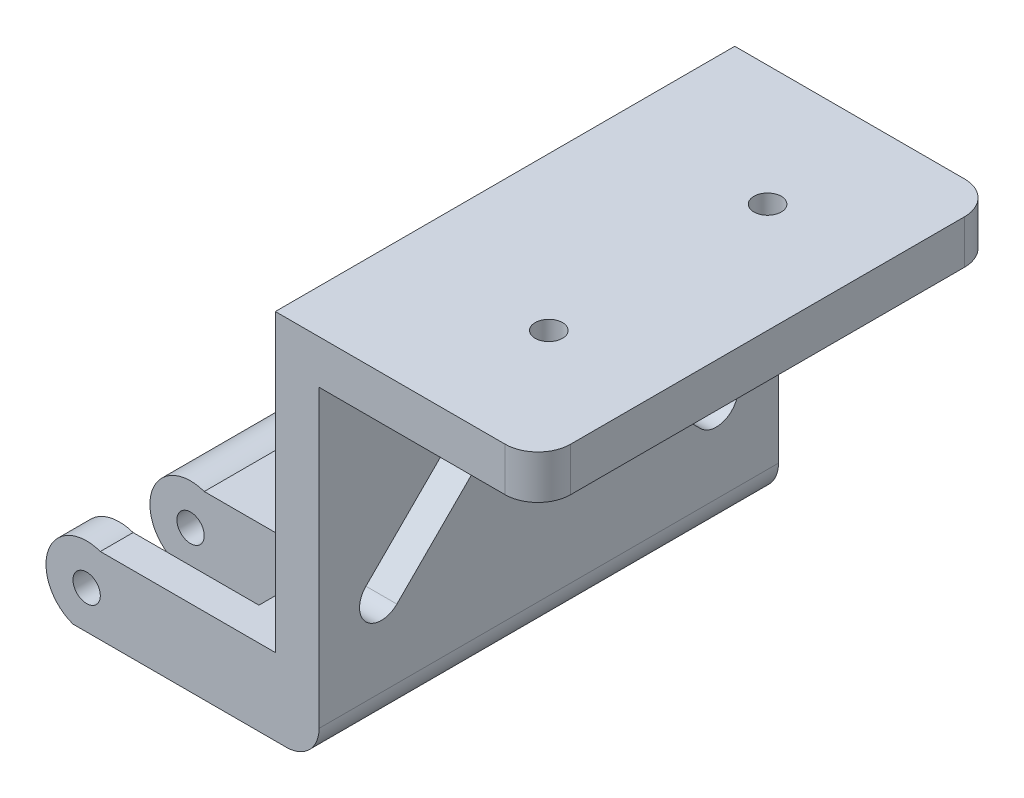
ISO-10303-21;
HEADER;
FILE_DESCRIPTION(('STEP AP214'),'2;1');
FILE_NAME('part.step','',(''),(''),'','','');
FILE_SCHEMA(('AUTOMOTIVE_DESIGN { 1 0 10303 214 1 1 1 1 }'));
ENDSEC;
DATA;
#1=APPLICATION_CONTEXT('core data for automotive mechanical design processes');
#2=APPLICATION_PROTOCOL_DEFINITION('international standard','automotive_design',2000,#1);
#3=PRODUCT_CONTEXT('',#1,'mechanical');
#4=PRODUCT('Part','Part','',(#3));
#5=PRODUCT_RELATED_PRODUCT_CATEGORY('part','',(#4));
#6=PRODUCT_DEFINITION_FORMATION('','',#4);
#7=PRODUCT_DEFINITION_CONTEXT('part definition',#1,'design');
#8=PRODUCT_DEFINITION('design','',#6,#7);
#9=PRODUCT_DEFINITION_SHAPE('','',#8);
#10=(LENGTH_UNIT() NAMED_UNIT(*) SI_UNIT(.MILLI.,.METRE.));
#11=(NAMED_UNIT(*) PLANE_ANGLE_UNIT() SI_UNIT($,.RADIAN.));
#12=(NAMED_UNIT(*) SI_UNIT($,.STERADIAN.) SOLID_ANGLE_UNIT());
#13=UNCERTAINTY_MEASURE_WITH_UNIT(LENGTH_MEASURE(1.E-05),#10,'distance_accuracy_value','');
#14=(GEOMETRIC_REPRESENTATION_CONTEXT(3) GLOBAL_UNCERTAINTY_ASSIGNED_CONTEXT((#13)) GLOBAL_UNIT_ASSIGNED_CONTEXT((#10,
#11,#12)) REPRESENTATION_CONTEXT('',''));
#15=CARTESIAN_POINT('',(0.,0.,0.));
#16=DIRECTION('',(0.,0.,1.));
#17=DIRECTION('',(1.,0.,0.));
#18=AXIS2_PLACEMENT_3D('',#15,#16,#17);
#19=CARTESIAN_POINT('',(-31.25,-26.5,-21.));
#20=DIRECTION('',(0.,0.,-1.));
#21=DIRECTION('',(-1.,0.,0.));
#22=AXIS2_PLACEMENT_3D('',#19,#20,#21);
#23=CYLINDRICAL_SURFACE('',#22,1.24999999999999);
#24=CARTESIAN_POINT('',(-31.25,-26.5,11.5));
#25=DIRECTION('',(0.,0.,-1.));
#26=DIRECTION('',(-1.,0.,0.));
#27=AXIS2_PLACEMENT_3D('',#24,#25,#26);
#28=CIRCLE('',#27,1.24999999999999);
#29=CARTESIAN_POINT('',(-32.5,-26.5,11.5));
#30=VERTEX_POINT('',#29);
#31=EDGE_CURVE('E438',#30,#30,#28,.F.);
#32=ORIENTED_EDGE('',*,*,#31,.T.);
#33=EDGE_LOOP('',(#32));
#34=FACE_BOUND('',#33,.T.);
#35=CARTESIAN_POINT('',(-31.25,-26.5,-11.5));
#36=DIRECTION('',(0.,0.,-1.));
#37=DIRECTION('',(-1.,0.,0.));
#38=AXIS2_PLACEMENT_3D('',#35,#36,#37);
#39=CIRCLE('',#38,1.24999999999999);
#40=CARTESIAN_POINT('',(-32.5,-26.5,-11.5));
#41=VERTEX_POINT('',#40);
#42=EDGE_CURVE('E20',#41,#41,#39,.T.);
#43=ORIENTED_EDGE('',*,*,#42,.T.);
#44=EDGE_LOOP('',(#43));
#45=FACE_BOUND('',#44,.T.);
#46=ADVANCED_FACE('F17',(#34,#45),#23,.F.);
#47=CARTESIAN_POINT('',(-49.9665171868296,4.,-18.));
#48=DIRECTION('',(0.,0.,-1.));
#49=DIRECTION('',(-1.,0.,0.));
#50=AXIS2_PLACEMENT_3D('',#47,#48,#49);
#51=PLANE('',#50);
#52=DIRECTION('',(1.,0.,0.));
#53=VECTOR('',#52,1.);
#54=CARTESIAN_POINT('',(-9.99999999999999,-30.,-18.));
#55=LINE('',#54,#53);
#56=CARTESIAN_POINT('',(-19.9665171868296,-30.,-18.));
#57=VERTEX_POINT('',#56);
#58=CARTESIAN_POINT('',(-32.5,-30.,-18.));
#59=VERTEX_POINT('',#58);
#60=EDGE_CURVE('E349',#57,#59,#55,.F.);
#61=ORIENTED_EDGE('',*,*,#60,.F.);
#62=DIRECTION('',(0.,1.,0.));
#63=VECTOR('',#62,1.);
#64=CARTESIAN_POINT('',(-19.9665171868296,4.,-18.));
#65=LINE('',#64,#63);
#66=CARTESIAN_POINT('',(-19.9665171868296,-23.,-18.));
#67=VERTEX_POINT('',#66);
#68=EDGE_CURVE('E344',#57,#67,#65,.T.);
#69=ORIENTED_EDGE('',*,*,#68,.T.);
#70=DIRECTION('',(-1.,0.,0.));
#71=VECTOR('',#70,1.);
#72=CARTESIAN_POINT('',(-9.99999999999999,-23.,-18.));
#73=LINE('',#72,#71);
#74=CARTESIAN_POINT('',(-30.,-23.,-18.));
#75=VERTEX_POINT('',#74);
#76=EDGE_CURVE('E251',#75,#67,#73,.F.);
#77=ORIENTED_EDGE('',*,*,#76,.F.);
#78=CARTESIAN_POINT('',(-31.25,-26.5,-18.));
#79=DIRECTION('',(0.,0.,1.));
#80=DIRECTION('',(1.,0.,0.));
#81=AXIS2_PLACEMENT_3D('',#78,#79,#80);
#82=CIRCLE('',#81,3.71651718682962);
#83=EDGE_CURVE('E252',#59,#75,#82,.F.);
#84=ORIENTED_EDGE('',*,*,#83,.F.);
#85=EDGE_LOOP('',(#61,#69,#77,#84));
#86=FACE_BOUND('',#85,.T.);
#87=CARTESIAN_POINT('',(-31.25,-26.5,-18.));
#88=DIRECTION('',(0.,0.,-1.));
#89=DIRECTION('',(-1.,0.,0.));
#90=AXIS2_PLACEMENT_3D('',#87,#88,#89);
#91=CIRCLE('',#90,1.24999999999999);
#92=CARTESIAN_POINT('',(-32.5,-26.5,-18.));
#93=VERTEX_POINT('',#92);
#94=EDGE_CURVE('E274',#93,#93,#91,.T.);
#95=ORIENTED_EDGE('',*,*,#94,.T.);
#96=EDGE_LOOP('',(#95));
#97=FACE_BOUND('',#96,.T.);
#98=ADVANCED_FACE('F470',(#86,#97),#51,.F.);
#99=CARTESIAN_POINT('',(-19.9665171868296,4.,-11.5));
#100=DIRECTION('',(1.,0.,0.));
#101=DIRECTION('',(0.,1.,0.));
#102=AXIS2_PLACEMENT_3D('',#99,#100,#101);
#103=PLANE('',#102);
#104=ORIENTED_EDGE('',*,*,#68,.F.);
#105=DIRECTION('',(0.,0.,1.));
#106=VECTOR('',#105,1.);
#107=CARTESIAN_POINT('',(-19.9665171868296,-30.,-46.9885571116995));
#108=LINE('',#107,#106);
#109=CARTESIAN_POINT('',(-19.9665171868296,-30.,-11.5));
#110=VERTEX_POINT('',#109);
#111=EDGE_CURVE('E351',#110,#57,#108,.F.);
#112=ORIENTED_EDGE('',*,*,#111,.F.);
#113=DIRECTION('',(0.,1.,0.));
#114=VECTOR('',#113,1.);
#115=CARTESIAN_POINT('',(-19.9665171868296,4.,-11.5));
#116=LINE('',#115,#114);
#117=CARTESIAN_POINT('',(-19.9665171868296,-23.,-11.5));
#118=VERTEX_POINT('',#117);
#119=EDGE_CURVE('E334',#110,#118,#116,.T.);
#120=ORIENTED_EDGE('',*,*,#119,.T.);
#121=DIRECTION('',(0.,0.,1.));
#122=VECTOR('',#121,1.);
#123=CARTESIAN_POINT('',(-19.9665171868296,-23.,-46.9885571116995));
#124=LINE('',#123,#122);
#125=EDGE_CURVE('E300',#67,#118,#124,.T.);
#126=ORIENTED_EDGE('',*,*,#125,.F.);
#127=EDGE_LOOP('',(#104,#112,#120,#126));
#128=FACE_BOUND('',#127,.T.);
#129=ADVANCED_FACE('F459',(#128),#103,.F.);
#130=CARTESIAN_POINT('',(-49.9665171868296,4.,-11.5));
#131=DIRECTION('',(0.,0.,1.));
#132=DIRECTION('',(1.,0.,0.));
#133=AXIS2_PLACEMENT_3D('',#130,#131,#132);
#134=PLANE('',#133);
#135=DIRECTION('',(-1.,0.,0.));
#136=VECTOR('',#135,1.);
#137=CARTESIAN_POINT('',(-9.99999999999999,-23.,-11.5));
#138=LINE('',#137,#136);
#139=CARTESIAN_POINT('',(-30.,-23.,-11.5));
#140=VERTEX_POINT('',#139);
#141=EDGE_CURVE('E330',#118,#140,#138,.T.);
#142=ORIENTED_EDGE('',*,*,#141,.F.);
#143=ORIENTED_EDGE('',*,*,#119,.F.);
#144=DIRECTION('',(1.,0.,0.));
#145=VECTOR('',#144,1.);
#146=CARTESIAN_POINT('',(-9.99999999999999,-30.,-11.5));
#147=LINE('',#146,#145);
#148=CARTESIAN_POINT('',(-32.5,-30.,-11.5));
#149=VERTEX_POINT('',#148);
#150=EDGE_CURVE('E356',#149,#110,#147,.T.);
#151=ORIENTED_EDGE('',*,*,#150,.F.);
#152=CARTESIAN_POINT('',(-31.25,-26.5,-11.5));
#153=DIRECTION('',(0.,0.,1.));
#154=DIRECTION('',(1.,0.,0.));
#155=AXIS2_PLACEMENT_3D('',#152,#153,#154);
#156=CIRCLE('',#155,3.71651718682962);
#157=EDGE_CURVE('E337',#140,#149,#156,.T.);
#158=ORIENTED_EDGE('',*,*,#157,.F.);
#159=EDGE_LOOP('',(#142,#143,#151,#158));
#160=FACE_BOUND('',#159,.T.);
#161=ORIENTED_EDGE('',*,*,#42,.F.);
#162=EDGE_LOOP('',(#161));
#163=FACE_BOUND('',#162,.T.);
#164=ADVANCED_FACE('F453',(#160,#163),#134,.F.);
#165=CARTESIAN_POINT('',(-31.25,-26.5,-46.9885571116995));
#166=DIRECTION('',(0.,0.,1.));
#167=DIRECTION('',(1.,0.,0.));
#168=AXIS2_PLACEMENT_3D('',#165,#166,#167);
#169=CYLINDRICAL_SURFACE('',#168,3.71651718682962);
#170=CARTESIAN_POINT('',(-31.25,-26.5,11.5));
#171=DIRECTION('',(0.,0.,1.));
#172=DIRECTION('',(1.,0.,0.));
#173=AXIS2_PLACEMENT_3D('',#170,#171,#172);
#174=CIRCLE('',#173,3.71651718682962);
#175=CARTESIAN_POINT('',(-32.5,-30.,11.5));
#176=VERTEX_POINT('',#175);
#177=CARTESIAN_POINT('',(-30.,-23.,11.5));
#178=VERTEX_POINT('',#177);
#179=EDGE_CURVE('E321',#176,#178,#174,.F.);
#180=ORIENTED_EDGE('',*,*,#179,.T.);
#181=DIRECTION('',(0.,0.,1.));
#182=VECTOR('',#181,1.);
#183=CARTESIAN_POINT('',(-30.,-23.,-46.9885571116995));
#184=LINE('',#183,#182);
#185=EDGE_CURVE('E326',#140,#178,#184,.T.);
#186=ORIENTED_EDGE('',*,*,#185,.F.);
#187=ORIENTED_EDGE('',*,*,#157,.T.);
#188=DIRECTION('',(0.,0.,1.));
#189=VECTOR('',#188,1.);
#190=CARTESIAN_POINT('',(-32.5,-30.,-46.9885571116995));
#191=LINE('',#190,#189);
#192=EDGE_CURVE('E361',#176,#149,#191,.F.);
#193=ORIENTED_EDGE('',*,*,#192,.F.);
#194=EDGE_LOOP('',(#180,#186,#187,#193));
#195=FACE_BOUND('',#194,.T.);
#196=ADVANCED_FACE('F444',(#195),#169,.T.);
#197=CARTESIAN_POINT('',(-48.5,4.,11.5));
#198=DIRECTION('',(0.,0.,-1.));
#199=DIRECTION('',(-1.,0.,0.));
#200=AXIS2_PLACEMENT_3D('',#197,#198,#199);
#201=PLANE('',#200);
#202=ORIENTED_EDGE('',*,*,#179,.F.);
#203=DIRECTION('',(1.,0.,0.));
#204=VECTOR('',#203,1.);
#205=CARTESIAN_POINT('',(-9.99999999999999,-30.,11.5));
#206=LINE('',#205,#204);
#207=CARTESIAN_POINT('',(-18.5,-30.,11.5));
#208=VERTEX_POINT('',#207);
#209=EDGE_CURVE('E366',#208,#176,#206,.F.);
#210=ORIENTED_EDGE('',*,*,#209,.F.);
#211=DIRECTION('',(0.,1.,0.));
#212=VECTOR('',#211,1.);
#213=CARTESIAN_POINT('',(-18.5,4.,11.5));
#214=LINE('',#213,#212);
#215=CARTESIAN_POINT('',(-18.5,-23.,11.5));
#216=VERTEX_POINT('',#215);
#217=EDGE_CURVE('E311',#208,#216,#214,.T.);
#218=ORIENTED_EDGE('',*,*,#217,.T.);
#219=DIRECTION('',(-1.,0.,0.));
#220=VECTOR('',#219,1.);
#221=CARTESIAN_POINT('',(-9.99999999999999,-23.,11.5));
#222=LINE('',#221,#220);
#223=EDGE_CURVE('E316',#178,#216,#222,.F.);
#224=ORIENTED_EDGE('',*,*,#223,.F.);
#225=EDGE_LOOP('',(#202,#210,#218,#224));
#226=FACE_BOUND('',#225,.T.);
#227=ORIENTED_EDGE('',*,*,#31,.F.);
#228=EDGE_LOOP('',(#227));
#229=FACE_BOUND('',#228,.T.);
#230=ADVANCED_FACE('F649',(#226,#229),#201,.F.);
#231=CARTESIAN_POINT('',(-18.5,4.,18.));
#232=DIRECTION('',(1.,0.,0.));
#233=DIRECTION('',(0.,0.,-1.));
#234=AXIS2_PLACEMENT_3D('',#231,#232,#233);
#235=PLANE('',#234);
#236=ORIENTED_EDGE('',*,*,#217,.F.);
#237=DIRECTION('',(0.,0.,1.));
#238=VECTOR('',#237,1.);
#239=CARTESIAN_POINT('',(-18.5,-30.,-46.9885571116995));
#240=LINE('',#239,#238);
#241=CARTESIAN_POINT('',(-18.5,-30.,18.));
#242=VERTEX_POINT('',#241);
#243=EDGE_CURVE('E369',#242,#208,#240,.F.);
#244=ORIENTED_EDGE('',*,*,#243,.F.);
#245=DIRECTION('',(0.,1.,0.));
#246=VECTOR('',#245,1.);
#247=CARTESIAN_POINT('',(-18.5,4.,18.));
#248=LINE('',#247,#246);
#249=CARTESIAN_POINT('',(-18.5,-23.,18.));
#250=VERTEX_POINT('',#249);
#251=EDGE_CURVE('E307',#242,#250,#248,.T.);
#252=ORIENTED_EDGE('',*,*,#251,.T.);
#253=DIRECTION('',(0.,0.,1.));
#254=VECTOR('',#253,1.);
#255=CARTESIAN_POINT('',(-18.5,-23.,-46.9885571116995));
#256=LINE('',#255,#254);
#257=EDGE_CURVE('E304',#216,#250,#256,.T.);
#258=ORIENTED_EDGE('',*,*,#257,.F.);
#259=EDGE_LOOP('',(#236,#244,#252,#258));
#260=FACE_BOUND('',#259,.T.);
#261=ADVANCED_FACE('F645',(#260),#235,.F.);
#262=CARTESIAN_POINT('',(-48.5,4.,18.));
#263=DIRECTION('',(0.,0.,1.));
#264=DIRECTION('',(1.,0.,0.));
#265=AXIS2_PLACEMENT_3D('',#262,#263,#264);
#266=PLANE('',#265);
#267=ORIENTED_EDGE('',*,*,#251,.F.);
#268=DIRECTION('',(1.,0.,0.));
#269=VECTOR('',#268,1.);
#270=CARTESIAN_POINT('',(-9.99999999999999,-30.,18.));
#271=LINE('',#270,#269);
#272=CARTESIAN_POINT('',(-32.5,-30.,18.));
#273=VERTEX_POINT('',#272);
#274=EDGE_CURVE('E291',#273,#242,#271,.T.);
#275=ORIENTED_EDGE('',*,*,#274,.F.);
#276=CARTESIAN_POINT('',(-31.25,-26.5,18.));
#277=DIRECTION('',(0.,0.,1.));
#278=DIRECTION('',(1.,0.,0.));
#279=AXIS2_PLACEMENT_3D('',#276,#277,#278);
#280=CIRCLE('',#279,3.71651718682962);
#281=CARTESIAN_POINT('',(-30.,-23.,18.));
#282=VERTEX_POINT('',#281);
#283=EDGE_CURVE('E288',#282,#273,#280,.T.);
#284=ORIENTED_EDGE('',*,*,#283,.F.);
#285=DIRECTION('',(-1.,0.,0.));
#286=VECTOR('',#285,1.);
#287=CARTESIAN_POINT('',(-9.99999999999999,-23.,18.));
#288=LINE('',#287,#286);
#289=EDGE_CURVE('E297',#250,#282,#288,.T.);
#290=ORIENTED_EDGE('',*,*,#289,.F.);
#291=EDGE_LOOP('',(#267,#275,#284,#290));
#292=FACE_BOUND('',#291,.T.);
#293=CARTESIAN_POINT('',(-31.25,-26.5,18.));
#294=DIRECTION('',(0.,0.,-1.));
#295=DIRECTION('',(-1.,0.,0.));
#296=AXIS2_PLACEMENT_3D('',#293,#294,#295);
#297=CIRCLE('',#296,1.24999999999999);
#298=CARTESIAN_POINT('',(-32.5,-26.5,18.));
#299=VERTEX_POINT('',#298);
#300=EDGE_CURVE('E310',#299,#299,#297,.F.);
#301=ORIENTED_EDGE('',*,*,#300,.T.);
#302=EDGE_LOOP('',(#301));
#303=FACE_BOUND('',#302,.T.);
#304=ADVANCED_FACE('F641',(#292,#303),#266,.F.);
#305=CARTESIAN_POINT('',(-31.25,-26.5,-21.));
#306=DIRECTION('',(0.,0.,-1.));
#307=DIRECTION('',(-1.,0.,0.));
#308=AXIS2_PLACEMENT_3D('',#305,#306,#307);
#309=CYLINDRICAL_SURFACE('',#308,1.24999999999999);
#310=CARTESIAN_POINT('',(-31.25,-26.5,21.));
#311=DIRECTION('',(0.,0.,-1.));
#312=DIRECTION('',(-1.,0.,0.));
#313=AXIS2_PLACEMENT_3D('',#310,#311,#312);
#314=CIRCLE('',#313,1.24999999999999);
#315=CARTESIAN_POINT('',(-32.5,-26.5,21.));
#316=VERTEX_POINT('',#315);
#317=EDGE_CURVE('E415',#316,#316,#314,.F.);
#318=ORIENTED_EDGE('',*,*,#317,.T.);
#319=EDGE_LOOP('',(#318));
#320=FACE_BOUND('',#319,.T.);
#321=ORIENTED_EDGE('',*,*,#300,.F.);
#322=EDGE_LOOP('',(#321));
#323=FACE_BOUND('',#322,.T.);
#324=ADVANCED_FACE('F637',(#320,#323),#309,.F.);
#325=CARTESIAN_POINT('',(-31.25,-26.5,-46.9885571116995));
#326=DIRECTION('',(0.,0.,1.));
#327=DIRECTION('',(1.,0.,0.));
#328=AXIS2_PLACEMENT_3D('',#325,#326,#327);
#329=CYLINDRICAL_SURFACE('',#328,3.71651718682962);
#330=CARTESIAN_POINT('',(-31.25,-26.5,21.));
#331=DIRECTION('',(0.,0.,1.));
#332=DIRECTION('',(1.,0.,0.));
#333=AXIS2_PLACEMENT_3D('',#330,#331,#332);
#334=CIRCLE('',#333,3.71651718682962);
#335=CARTESIAN_POINT('',(-32.5,-30.,21.));
#336=VERTEX_POINT('',#335);
#337=CARTESIAN_POINT('',(-30.,-23.,21.));
#338=VERTEX_POINT('',#337);
#339=EDGE_CURVE('E219',#336,#338,#334,.F.);
#340=ORIENTED_EDGE('',*,*,#339,.T.);
#341=DIRECTION('',(0.,0.,1.));
#342=VECTOR('',#341,1.);
#343=CARTESIAN_POINT('',(-30.,-23.,-46.9885571116995));
#344=LINE('',#343,#342);
#345=EDGE_CURVE('E247',#282,#338,#344,.T.);
#346=ORIENTED_EDGE('',*,*,#345,.F.);
#347=ORIENTED_EDGE('',*,*,#283,.T.);
#348=DIRECTION('',(0.,0.,1.));
#349=VECTOR('',#348,1.);
#350=CARTESIAN_POINT('',(-32.5,-30.,-46.9885571116995));
#351=LINE('',#350,#349);
#352=EDGE_CURVE('E255',#336,#273,#351,.F.);
#353=ORIENTED_EDGE('',*,*,#352,.F.);
#354=EDGE_LOOP('',(#340,#346,#347,#353));
#355=FACE_BOUND('',#354,.T.);
#356=ADVANCED_FACE('F633',(#355),#329,.T.);
#357=CARTESIAN_POINT('',(-20.,-19.3033008588991,15.3033008588991));
#358=DIRECTION('',(1.,0.,0.));
#359=DIRECTION('',(0.,1.,0.));
#360=AXIS2_PLACEMENT_3D('',#357,#358,#359);
#361=CYLINDRICAL_SURFACE('',#360,2.);
#362=DIRECTION('',(1.,0.,0.));
#363=VECTOR('',#362,1.);
#364=CARTESIAN_POINT('',(-20.,-17.889087296526,16.7175144212722));
#365=LINE('',#364,#363);
#366=CARTESIAN_POINT('',(-14.,-17.889087296526,16.7175144212722));
#367=VERTEX_POINT('',#366);
#368=CARTESIAN_POINT('',(-9.99999999999999,-17.889087296526,16.7175144212722));
#369=VERTEX_POINT('',#368);
#370=EDGE_CURVE('E187',#367,#369,#365,.T.);
#371=ORIENTED_EDGE('',*,*,#370,.T.);
#372=CARTESIAN_POINT('',(-9.99999999999999,-19.3033008588991,15.3033008588991));
#373=DIRECTION('',(1.,0.,0.));
#374=DIRECTION('',(0.,1.,0.));
#375=AXIS2_PLACEMENT_3D('',#372,#373,#374);
#376=CIRCLE('',#375,2.);
#377=CARTESIAN_POINT('',(-9.99999999999999,-20.7175144212722,13.889087296526));
#378=VERTEX_POINT('',#377);
#379=EDGE_CURVE('E270',#378,#369,#376,.F.);
#380=ORIENTED_EDGE('',*,*,#379,.F.);
#381=DIRECTION('',(1.,0.,0.));
#382=VECTOR('',#381,1.);
#383=CARTESIAN_POINT('',(-20.,-20.7175144212722,13.889087296526));
#384=LINE('',#383,#382);
#385=CARTESIAN_POINT('',(-14.,-20.7175144212722,13.889087296526));
#386=VERTEX_POINT('',#385);
#387=EDGE_CURVE('E285',#378,#386,#384,.F.);
#388=ORIENTED_EDGE('',*,*,#387,.T.);
#389=CARTESIAN_POINT('',(-14.,-19.3033008588991,15.3033008588991));
#390=DIRECTION('',(1.,0.,0.));
#391=DIRECTION('',(0.,1.,0.));
#392=AXIS2_PLACEMENT_3D('',#389,#390,#391);
#393=CIRCLE('',#392,2.);
#394=EDGE_CURVE('E198',#367,#386,#393,.T.);
#395=ORIENTED_EDGE('',*,*,#394,.F.);
#396=EDGE_LOOP('',(#371,#380,#388,#395));
#397=FACE_BOUND('',#396,.T.);
#398=ADVANCED_FACE('F629',(#397),#361,.F.);
#399=CARTESIAN_POINT('',(-20.,-20.7175144212722,13.889087296526));
#400=DIRECTION('',(0.,-0.707106781186548,-0.707106781186548));
#401=DIRECTION('',(0.,0.707106781186548,-0.707106781186548));
#402=AXIS2_PLACEMENT_3D('',#399,#400,#401);
#403=PLANE('',#402);
#404=ORIENTED_EDGE('',*,*,#387,.F.);
#405=DIRECTION('',(0.,-0.707106781186548,0.707106781186547));
#406=VECTOR('',#405,1.);
#407=CARTESIAN_POINT('',(-9.99999999999999,-10.110912703474,3.2824855787278));
#408=LINE('',#407,#406);
#409=CARTESIAN_POINT('',(-9.99999999999999,-10.110912703474,3.2824855787278));
#410=VERTEX_POINT('',#409);
#411=EDGE_CURVE('E265',#410,#378,#408,.T.);
#412=ORIENTED_EDGE('',*,*,#411,.F.);
#413=DIRECTION('',(1.,0.,0.));
#414=VECTOR('',#413,1.);
#415=CARTESIAN_POINT('',(-20.,-10.110912703474,3.2824855787278));
#416=LINE('',#415,#414);
#417=CARTESIAN_POINT('',(-14.,-10.110912703474,3.2824855787278));
#418=VERTEX_POINT('',#417);
#419=EDGE_CURVE('E283',#410,#418,#416,.F.);
#420=ORIENTED_EDGE('',*,*,#419,.T.);
#421=DIRECTION('',(0.,0.707106781186547,-0.707106781186548));
#422=VECTOR('',#421,1.);
#423=CARTESIAN_POINT('',(-14.,-20.7175144212722,13.889087296526));
#424=LINE('',#423,#422);
#425=EDGE_CURVE('E173',#386,#418,#424,.T.);
#426=ORIENTED_EDGE('',*,*,#425,.F.);
#427=EDGE_LOOP('',(#404,#412,#420,#426));
#428=FACE_BOUND('',#427,.T.);
#429=ADVANCED_FACE('F626',(#428),#403,.F.);
#430=CARTESIAN_POINT('',(-20.,-8.6966991411009,4.6966991411009));
#431=DIRECTION('',(1.,0.,0.));
#432=DIRECTION('',(0.,1.,0.));
#433=AXIS2_PLACEMENT_3D('',#430,#431,#432);
#434=CYLINDRICAL_SURFACE('',#433,2.);
#435=CARTESIAN_POINT('',(-14.,-8.6966991411009,4.6966991411009));
#436=DIRECTION('',(1.,0.,0.));
#437=DIRECTION('',(0.,1.,0.));
#438=AXIS2_PLACEMENT_3D('',#435,#436,#437);
#439=CIRCLE('',#438,2.);
#440=CARTESIAN_POINT('',(-14.,-7.2824855787278,6.11091270347399));
#441=VERTEX_POINT('',#440);
#442=EDGE_CURVE('E165',#418,#441,#439,.T.);
#443=ORIENTED_EDGE('',*,*,#442,.F.);
#444=ORIENTED_EDGE('',*,*,#419,.F.);
#445=CARTESIAN_POINT('',(-9.99999999999999,-8.6966991411009,4.6966991411009));
#446=DIRECTION('',(1.,0.,0.));
#447=DIRECTION('',(0.,1.,0.));
#448=AXIS2_PLACEMENT_3D('',#445,#446,#447);
#449=CIRCLE('',#448,2.);
#450=CARTESIAN_POINT('',(-9.99999999999999,-7.2824855787278,6.11091270347399));
#451=VERTEX_POINT('',#450);
#452=EDGE_CURVE('E182',#451,#410,#449,.F.);
#453=ORIENTED_EDGE('',*,*,#452,.F.);
#454=DIRECTION('',(1.,0.,0.));
#455=VECTOR('',#454,1.);
#456=CARTESIAN_POINT('',(-20.,-7.2824855787278,6.11091270347399));
#457=LINE('',#456,#455);
#458=EDGE_CURVE('E179',#451,#441,#457,.F.);
#459=ORIENTED_EDGE('',*,*,#458,.T.);
#460=EDGE_LOOP('',(#443,#444,#453,#459));
#461=FACE_BOUND('',#460,.T.);
#462=ADVANCED_FACE('F180',(#461),#434,.F.);
#463=CARTESIAN_POINT('',(-20.,-17.889087296526,16.7175144212722));
#464=DIRECTION('',(0.,0.707106781186547,0.707106781186548));
#465=DIRECTION('',(0.,-0.707106781186548,0.707106781186547));
#466=AXIS2_PLACEMENT_3D('',#463,#464,#465);
#467=PLANE('',#466);
#468=ORIENTED_EDGE('',*,*,#458,.F.);
#469=DIRECTION('',(0.,0.707106781186548,-0.707106781186547));
#470=VECTOR('',#469,1.);
#471=CARTESIAN_POINT('',(-9.99999999999999,-17.889087296526,16.7175144212722));
#472=LINE('',#471,#470);
#473=EDGE_CURVE('E268',#369,#451,#472,.T.);
#474=ORIENTED_EDGE('',*,*,#473,.F.);
#475=ORIENTED_EDGE('',*,*,#370,.F.);
#476=DIRECTION('',(0.,-0.707106781186548,0.707106781186547));
#477=VECTOR('',#476,1.);
#478=CARTESIAN_POINT('',(-14.,-7.2824855787278,6.110912703474));
#479=LINE('',#478,#477);
#480=EDGE_CURVE('E170',#441,#367,#479,.T.);
#481=ORIENTED_EDGE('',*,*,#480,.F.);
#482=EDGE_LOOP('',(#468,#474,#475,#481));
#483=FACE_BOUND('',#482,.T.);
#484=ADVANCED_FACE('F189',(#483),#467,.F.);
#485=CARTESIAN_POINT('',(-20.,-20.7175144212722,-13.889087296526));
#486=DIRECTION('',(0.,0.707106781186548,-0.707106781186548));
#487=DIRECTION('',(0.,0.707106781186548,0.707106781186548));
#488=AXIS2_PLACEMENT_3D('',#485,#486,#487);
#489=PLANE('',#488);
#490=DIRECTION('',(1.,0.,0.));
#491=VECTOR('',#490,1.);
#492=CARTESIAN_POINT('',(-20.,-20.7175144212722,-13.889087296526));
#493=LINE('',#492,#491);
#494=CARTESIAN_POINT('',(-9.99999999999999,-20.7175144212722,-13.889087296526));
#495=VERTEX_POINT('',#494);
#496=CARTESIAN_POINT('',(-14.,-20.7175144212722,-13.889087296526));
#497=VERTEX_POINT('',#496);
#498=EDGE_CURVE('E186',#495,#497,#493,.F.);
#499=ORIENTED_EDGE('',*,*,#498,.T.);
#500=DIRECTION('',(0.,-0.707106781186548,-0.707106781186548));
#501=VECTOR('',#500,1.);
#502=CARTESIAN_POINT('',(-14.,-10.110912703474,-3.2824855787278));
#503=LINE('',#502,#501);
#504=CARTESIAN_POINT('',(-14.,-10.110912703474,-3.2824855787278));
#505=VERTEX_POINT('',#504);
#506=EDGE_CURVE('E191',#505,#497,#503,.T.);
#507=ORIENTED_EDGE('',*,*,#506,.F.);
#508=DIRECTION('',(1.,0.,0.));
#509=VECTOR('',#508,1.);
#510=CARTESIAN_POINT('',(-20.,-10.110912703474,-3.28248557872781));
#511=LINE('',#510,#509);
#512=CARTESIAN_POINT('',(-9.99999999999999,-10.110912703474,-3.2824855787278));
#513=VERTEX_POINT('',#512);
#514=EDGE_CURVE('E271',#505,#513,#511,.T.);
#515=ORIENTED_EDGE('',*,*,#514,.T.);
#516=DIRECTION('',(0.,0.707106781186548,0.707106781186548));
#517=VECTOR('',#516,1.);
#518=CARTESIAN_POINT('',(-9.99999999999999,-20.7175144212722,-13.889087296526));
#519=LINE('',#518,#517);
#520=EDGE_CURVE('E259',#495,#513,#519,.T.);
#521=ORIENTED_EDGE('',*,*,#520,.F.);
#522=EDGE_LOOP('',(#499,#507,#515,#521));
#523=FACE_BOUND('',#522,.T.);
#524=ADVANCED_FACE('F515',(#523),#489,.T.);
#525=CARTESIAN_POINT('',(-20.,-19.3033008588991,-15.3033008588991));
#526=DIRECTION('',(1.,0.,0.));
#527=DIRECTION('',(0.,1.,0.));
#528=AXIS2_PLACEMENT_3D('',#525,#526,#527);
#529=CYLINDRICAL_SURFACE('',#528,2.);
#530=CARTESIAN_POINT('',(-9.99999999999999,-19.3033008588991,-15.3033008588991));
#531=DIRECTION('',(1.,0.,0.));
#532=DIRECTION('',(0.,1.,0.));
#533=AXIS2_PLACEMENT_3D('',#530,#531,#532);
#534=CIRCLE('',#533,2.);
#535=CARTESIAN_POINT('',(-9.99999999999999,-17.889087296526,-16.7175144212722));
#536=VERTEX_POINT('',#535);
#537=EDGE_CURVE('E261',#536,#495,#534,.F.);
#538=ORIENTED_EDGE('',*,*,#537,.F.);
#539=DIRECTION('',(1.,0.,0.));
#540=VECTOR('',#539,1.);
#541=CARTESIAN_POINT('',(-20.,-17.889087296526,-16.7175144212722));
#542=LINE('',#541,#540);
#543=CARTESIAN_POINT('',(-14.,-17.889087296526,-16.7175144212722));
#544=VERTEX_POINT('',#543);
#545=EDGE_CURVE('E276',#544,#536,#542,.T.);
#546=ORIENTED_EDGE('',*,*,#545,.F.);
#547=CARTESIAN_POINT('',(-14.,-19.3033008588991,-15.3033008588991));
#548=DIRECTION('',(1.,0.,0.));
#549=DIRECTION('',(0.,1.,0.));
#550=AXIS2_PLACEMENT_3D('',#547,#548,#549);
#551=CIRCLE('',#550,2.);
#552=EDGE_CURVE('E193',#497,#544,#551,.T.);
#553=ORIENTED_EDGE('',*,*,#552,.F.);
#554=ORIENTED_EDGE('',*,*,#498,.F.);
#555=EDGE_LOOP('',(#538,#546,#553,#554));
#556=FACE_BOUND('',#555,.T.);
#557=ADVANCED_FACE('F518',(#556),#529,.F.);
#558=CARTESIAN_POINT('',(-20.,-17.889087296526,-16.7175144212722));
#559=DIRECTION('',(0.,-0.707106781186547,0.707106781186548));
#560=DIRECTION('',(0.,-0.707106781186548,-0.707106781186547));
#561=AXIS2_PLACEMENT_3D('',#558,#559,#560);
#562=PLANE('',#561);
#563=DIRECTION('',(1.,0.,0.));
#564=VECTOR('',#563,1.);
#565=CARTESIAN_POINT('',(-20.,-7.2824855787278,-6.11091270347399));
#566=LINE('',#565,#564);
#567=CARTESIAN_POINT('',(-9.99999999999999,-7.2824855787278,-6.11091270347399));
#568=VERTEX_POINT('',#567);
#569=CARTESIAN_POINT('',(-14.,-7.2824855787278,-6.11091270347399));
#570=VERTEX_POINT('',#569);
#571=EDGE_CURVE('E275',#568,#570,#566,.F.);
#572=ORIENTED_EDGE('',*,*,#571,.T.);
#573=DIRECTION('',(0.,0.707106781186548,0.707106781186548));
#574=VECTOR('',#573,1.);
#575=CARTESIAN_POINT('',(-14.,-17.889087296526,-16.7175144212722));
#576=LINE('',#575,#574);
#577=EDGE_CURVE('E408',#544,#570,#576,.T.);
#578=ORIENTED_EDGE('',*,*,#577,.F.);
#579=ORIENTED_EDGE('',*,*,#545,.T.);
#580=DIRECTION('',(0.,-0.707106781186548,-0.707106781186547));
#581=VECTOR('',#580,1.);
#582=CARTESIAN_POINT('',(-9.99999999999999,-7.2824855787278,-6.110912703474));
#583=LINE('',#582,#581);
#584=EDGE_CURVE('E262',#568,#536,#583,.T.);
#585=ORIENTED_EDGE('',*,*,#584,.F.);
#586=EDGE_LOOP('',(#572,#578,#579,#585));
#587=FACE_BOUND('',#586,.T.);
#588=ADVANCED_FACE('F507',(#587),#562,.T.);
#589=CARTESIAN_POINT('',(-20.,-8.6966991411009,-4.6966991411009));
#590=DIRECTION('',(1.,0.,0.));
#591=DIRECTION('',(0.,1.,0.));
#592=AXIS2_PLACEMENT_3D('',#589,#590,#591);
#593=CYLINDRICAL_SURFACE('',#592,2.);
#594=CARTESIAN_POINT('',(-14.,-8.6966991411009,-4.6966991411009));
#595=DIRECTION('',(1.,0.,0.));
#596=DIRECTION('',(0.,1.,0.));
#597=AXIS2_PLACEMENT_3D('',#594,#595,#596);
#598=CIRCLE('',#597,2.);
#599=EDGE_CURVE('E405',#570,#505,#598,.T.);
#600=ORIENTED_EDGE('',*,*,#599,.F.);
#601=ORIENTED_EDGE('',*,*,#571,.F.);
#602=CARTESIAN_POINT('',(-9.99999999999999,-8.6966991411009,-4.6966991411009));
#603=DIRECTION('',(1.,0.,0.));
#604=DIRECTION('',(0.,1.,0.));
#605=AXIS2_PLACEMENT_3D('',#602,#603,#604);
#606=CIRCLE('',#605,2.);
#607=EDGE_CURVE('E258',#513,#568,#606,.F.);
#608=ORIENTED_EDGE('',*,*,#607,.F.);
#609=ORIENTED_EDGE('',*,*,#514,.F.);
#610=EDGE_LOOP('',(#600,#601,#608,#609));
#611=FACE_BOUND('',#610,.T.);
#612=ADVANCED_FACE('F512',(#611),#593,.F.);
#613=CARTESIAN_POINT('',(-31.25,-26.5,-21.));
#614=DIRECTION('',(0.,0.,-1.));
#615=DIRECTION('',(-1.,0.,0.));
#616=AXIS2_PLACEMENT_3D('',#613,#614,#615);
#617=CYLINDRICAL_SURFACE('',#616,1.24999999999999);
#618=CARTESIAN_POINT('',(-31.25,-26.5,-21.));
#619=DIRECTION('',(0.,0.,-1.));
#620=DIRECTION('',(-1.,0.,0.));
#621=AXIS2_PLACEMENT_3D('',#618,#619,#620);
#622=CIRCLE('',#621,1.24999999999999);
#623=CARTESIAN_POINT('',(-32.5,-26.5,-21.));
#624=VERTEX_POINT('',#623);
#625=EDGE_CURVE('E402',#624,#624,#622,.F.);
#626=ORIENTED_EDGE('',*,*,#625,.F.);
#627=EDGE_LOOP('',(#626));
#628=FACE_BOUND('',#627,.T.);
#629=ORIENTED_EDGE('',*,*,#94,.F.);
#630=EDGE_LOOP('',(#629));
#631=FACE_BOUND('',#630,.T.);
#632=ADVANCED_FACE('F524',(#628,#631),#617,.F.);
#633=CARTESIAN_POINT('',(-10.,4.,-48.2946881279124));
#634=DIRECTION('',(1.,0.,0.));
#635=DIRECTION('',(0.,1.,0.));
#636=AXIS2_PLACEMENT_3D('',#633,#634,#635);
#637=PLANE('',#636);
#638=ORIENTED_EDGE('',*,*,#607,.T.);
#639=ORIENTED_EDGE('',*,*,#584,.T.);
#640=ORIENTED_EDGE('',*,*,#537,.T.);
#641=ORIENTED_EDGE('',*,*,#520,.T.);
#642=EDGE_LOOP('',(#638,#639,#640,#641));
#643=FACE_BOUND('',#642,.T.);
#644=ORIENTED_EDGE('',*,*,#452,.T.);
#645=ORIENTED_EDGE('',*,*,#411,.T.);
#646=ORIENTED_EDGE('',*,*,#379,.T.);
#647=ORIENTED_EDGE('',*,*,#473,.T.);
#648=EDGE_LOOP('',(#644,#645,#646,#647));
#649=FACE_BOUND('',#648,.T.);
#650=DIRECTION('',(0.,1.,0.));
#651=VECTOR('',#650,1.);
#652=CARTESIAN_POINT('',(-10.,4.,-21.));
#653=LINE('',#652,#651);
#654=CARTESIAN_POINT('',(-10.,0.,-21.));
#655=VERTEX_POINT('',#654);
#656=CARTESIAN_POINT('',(-10.,-27.,-21.));
#657=VERTEX_POINT('',#656);
#658=EDGE_CURVE('E401',#655,#657,#653,.F.);
#659=ORIENTED_EDGE('',*,*,#658,.F.);
#660=DIRECTION('',(0.,0.,-1.));
#661=VECTOR('',#660,1.);
#662=CARTESIAN_POINT('',(-10.,0.,0.));
#663=LINE('',#662,#661);
#664=CARTESIAN_POINT('',(-10.,0.,21.));
#665=VERTEX_POINT('',#664);
#666=EDGE_CURVE('E234',#665,#655,#663,.T.);
#667=ORIENTED_EDGE('',*,*,#666,.F.);
#668=DIRECTION('',(0.,1.,0.));
#669=VECTOR('',#668,1.);
#670=CARTESIAN_POINT('',(-10.,4.,21.));
#671=LINE('',#670,#669);
#672=CARTESIAN_POINT('',(-9.99999999999999,-27.,21.));
#673=VERTEX_POINT('',#672);
#674=EDGE_CURVE('E209',#665,#673,#671,.F.);
#675=ORIENTED_EDGE('',*,*,#674,.T.);
#676=DIRECTION('',(0.,0.,1.));
#677=VECTOR('',#676,1.);
#678=CARTESIAN_POINT('',(-9.99999999999999,-27.,-46.9885571116995));
#679=LINE('',#678,#677);
#680=EDGE_CURVE('E256',#657,#673,#679,.T.);
#681=ORIENTED_EDGE('',*,*,#680,.F.);
#682=EDGE_LOOP('',(#659,#667,#675,#681));
#683=FACE_BOUND('',#682,.T.);
#684=ADVANCED_FACE('F520',(#643,#649,#683),#637,.T.);
#685=CARTESIAN_POINT('',(-13.,-27.,-46.9885571116995));
#686=DIRECTION('',(0.,0.,1.));
#687=DIRECTION('',(1.,0.,0.));
#688=AXIS2_PLACEMENT_3D('',#685,#686,#687);
#689=CYLINDRICAL_SURFACE('',#688,3.);
#690=CARTESIAN_POINT('',(-13.,-27.,21.));
#691=DIRECTION('',(0.,0.,1.));
#692=DIRECTION('',(1.,0.,0.));
#693=AXIS2_PLACEMENT_3D('',#690,#691,#692);
#694=CIRCLE('',#693,3.);
#695=CARTESIAN_POINT('',(-13.,-30.,21.));
#696=VERTEX_POINT('',#695);
#697=EDGE_CURVE('E208',#673,#696,#694,.F.);
#698=ORIENTED_EDGE('',*,*,#697,.T.);
#699=DIRECTION('',(0.,0.,1.));
#700=VECTOR('',#699,1.);
#701=CARTESIAN_POINT('',(-13.,-30.,-46.9885571116995));
#702=LINE('',#701,#700);
#703=CARTESIAN_POINT('',(-13.,-30.,-21.));
#704=VERTEX_POINT('',#703);
#705=EDGE_CURVE('E253',#704,#696,#702,.T.);
#706=ORIENTED_EDGE('',*,*,#705,.F.);
#707=CARTESIAN_POINT('',(-13.,-27.,-21.));
#708=DIRECTION('',(0.,0.,1.));
#709=DIRECTION('',(1.,0.,0.));
#710=AXIS2_PLACEMENT_3D('',#707,#708,#709);
#711=CIRCLE('',#710,3.);
#712=EDGE_CURVE('E399',#657,#704,#711,.F.);
#713=ORIENTED_EDGE('',*,*,#712,.F.);
#714=ORIENTED_EDGE('',*,*,#680,.T.);
#715=EDGE_LOOP('',(#698,#706,#713,#714));
#716=FACE_BOUND('',#715,.T.);
#717=ADVANCED_FACE('F523',(#716),#689,.T.);
#718=CARTESIAN_POINT('',(-9.99999999999999,-30.,-46.9885571116995));
#719=DIRECTION('',(0.,-1.,0.));
#720=DIRECTION('',(1.,0.,0.));
#721=AXIS2_PLACEMENT_3D('',#718,#719,#720);
#722=PLANE('',#721);
#723=ORIENTED_EDGE('',*,*,#60,.T.);
#724=DIRECTION('',(0.,0.,1.));
#725=VECTOR('',#724,1.);
#726=CARTESIAN_POINT('',(-32.5,-30.,-46.9885571116995));
#727=LINE('',#726,#725);
#728=CARTESIAN_POINT('',(-32.5,-30.,-21.));
#729=VERTEX_POINT('',#728);
#730=EDGE_CURVE('E248',#729,#59,#727,.T.);
#731=ORIENTED_EDGE('',*,*,#730,.F.);
#732=DIRECTION('',(-1.,0.,0.));
#733=VECTOR('',#732,1.);
#734=CARTESIAN_POINT('',(-10.,-30.,-21.));
#735=LINE('',#734,#733);
#736=EDGE_CURVE('E398',#704,#729,#735,.T.);
#737=ORIENTED_EDGE('',*,*,#736,.F.);
#738=ORIENTED_EDGE('',*,*,#705,.T.);
#739=DIRECTION('',(-1.,0.,0.));
#740=VECTOR('',#739,1.);
#741=CARTESIAN_POINT('',(-10.,-30.,21.));
#742=LINE('',#741,#740);
#743=EDGE_CURVE('E205',#696,#336,#742,.T.);
#744=ORIENTED_EDGE('',*,*,#743,.T.);
#745=ORIENTED_EDGE('',*,*,#352,.T.);
#746=ORIENTED_EDGE('',*,*,#274,.T.);
#747=ORIENTED_EDGE('',*,*,#243,.T.);
#748=ORIENTED_EDGE('',*,*,#209,.T.);
#749=ORIENTED_EDGE('',*,*,#192,.T.);
#750=ORIENTED_EDGE('',*,*,#150,.T.);
#751=ORIENTED_EDGE('',*,*,#111,.T.);
#752=EDGE_LOOP('',(#723,#731,#737,#738,#744,#745,#746,#747,#748,#749,#750,#751));
#753=FACE_BOUND('',#752,.T.);
#754=ADVANCED_FACE('F449',(#753),#722,.T.);
#755=CARTESIAN_POINT('',(-31.25,-26.5,-46.9885571116995));
#756=DIRECTION('',(0.,0.,1.));
#757=DIRECTION('',(1.,0.,0.));
#758=AXIS2_PLACEMENT_3D('',#755,#756,#757);
#759=CYLINDRICAL_SURFACE('',#758,3.71651718682962);
#760=CARTESIAN_POINT('',(-31.25,-26.5,-21.));
#761=DIRECTION('',(0.,0.,1.));
#762=DIRECTION('',(1.,0.,0.));
#763=AXIS2_PLACEMENT_3D('',#760,#761,#762);
#764=CIRCLE('',#763,3.71651718682962);
#765=CARTESIAN_POINT('',(-30.,-23.,-21.));
#766=VERTEX_POINT('',#765);
#767=EDGE_CURVE('E395',#729,#766,#764,.F.);
#768=ORIENTED_EDGE('',*,*,#767,.F.);
#769=ORIENTED_EDGE('',*,*,#730,.T.);
#770=ORIENTED_EDGE('',*,*,#83,.T.);
#771=DIRECTION('',(0.,0.,1.));
#772=VECTOR('',#771,1.);
#773=CARTESIAN_POINT('',(-30.,-23.,-46.9885571116995));
#774=LINE('',#773,#772);
#775=EDGE_CURVE('E238',#766,#75,#774,.T.);
#776=ORIENTED_EDGE('',*,*,#775,.F.);
#777=EDGE_LOOP('',(#768,#769,#770,#776));
#778=FACE_BOUND('',#777,.T.);
#779=ADVANCED_FACE('F475',(#778),#759,.T.);
#780=CARTESIAN_POINT('',(-9.99999999999999,-23.,-46.9885571116995));
#781=DIRECTION('',(0.,1.,0.));
#782=DIRECTION('',(-1.,0.,0.));
#783=AXIS2_PLACEMENT_3D('',#780,#781,#782);
#784=PLANE('',#783);
#785=DIRECTION('',(-1.,0.,0.));
#786=VECTOR('',#785,1.);
#787=CARTESIAN_POINT('',(-10.,-23.,-21.));
#788=LINE('',#787,#786);
#789=CARTESIAN_POINT('',(-14.,-23.,-21.));
#790=VERTEX_POINT('',#789);
#791=EDGE_CURVE('E397',#766,#790,#788,.F.);
#792=ORIENTED_EDGE('',*,*,#791,.F.);
#793=ORIENTED_EDGE('',*,*,#775,.T.);
#794=ORIENTED_EDGE('',*,*,#76,.T.);
#795=ORIENTED_EDGE('',*,*,#125,.T.);
#796=ORIENTED_EDGE('',*,*,#141,.T.);
#797=ORIENTED_EDGE('',*,*,#185,.T.);
#798=ORIENTED_EDGE('',*,*,#223,.T.);
#799=ORIENTED_EDGE('',*,*,#257,.T.);
#800=ORIENTED_EDGE('',*,*,#289,.T.);
#801=ORIENTED_EDGE('',*,*,#345,.T.);
#802=DIRECTION('',(-1.,0.,0.));
#803=VECTOR('',#802,1.);
#804=CARTESIAN_POINT('',(-10.,-23.,21.));
#805=LINE('',#804,#803);
#806=CARTESIAN_POINT('',(-14.,-23.,21.));
#807=VERTEX_POINT('',#806);
#808=EDGE_CURVE('E215',#338,#807,#805,.F.);
#809=ORIENTED_EDGE('',*,*,#808,.T.);
#810=DIRECTION('',(0.,0.,1.));
#811=VECTOR('',#810,1.);
#812=CARTESIAN_POINT('',(-14.,-23.,-48.2946881279124));
#813=LINE('',#812,#811);
#814=EDGE_CURVE('E202',#790,#807,#813,.T.);
#815=ORIENTED_EDGE('',*,*,#814,.F.);
#816=EDGE_LOOP('',(#792,#793,#794,#795,#796,#797,#798,#799,#800,#801,#809,#815));
#817=FACE_BOUND('',#816,.T.);
#818=ADVANCED_FACE('F477',(#817),#784,.T.);
#819=CARTESIAN_POINT('',(0.,0.,0.));
#820=DIRECTION('',(0.,-1.,0.));
#821=DIRECTION('',(0.,0.,-1.));
#822=AXIS2_PLACEMENT_3D('',#819,#820,#821);
#823=PLANE('',#822);
#824=DIRECTION('',(-1.,0.,0.));
#825=VECTOR('',#824,1.);
#826=CARTESIAN_POINT('',(-10.,0.,21.));
#827=LINE('',#826,#825);
#828=CARTESIAN_POINT('',(7.,0.,21.));
#829=VERTEX_POINT('',#828);
#830=EDGE_CURVE('E212',#829,#665,#827,.T.);
#831=ORIENTED_EDGE('',*,*,#830,.T.);
#832=ORIENTED_EDGE('',*,*,#666,.T.);
#833=DIRECTION('',(-1.,0.,0.));
#834=VECTOR('',#833,1.);
#835=CARTESIAN_POINT('',(-10.,0.,-21.));
#836=LINE('',#835,#834);
#837=CARTESIAN_POINT('',(7.,0.,-21.));
#838=VERTEX_POINT('',#837);
#839=EDGE_CURVE('E227',#838,#655,#836,.T.);
#840=ORIENTED_EDGE('',*,*,#839,.F.);
#841=CARTESIAN_POINT('',(7.,0.,-18.));
#842=DIRECTION('',(0.,-1.,0.));
#843=DIRECTION('',(0.,0.,-1.));
#844=AXIS2_PLACEMENT_3D('',#841,#842,#843);
#845=CIRCLE('',#844,3.);
#846=CARTESIAN_POINT('',(10.,0.,-18.));
#847=VERTEX_POINT('',#846);
#848=EDGE_CURVE('E230',#847,#838,#845,.F.);
#849=ORIENTED_EDGE('',*,*,#848,.F.);
#850=DIRECTION('',(0.,0.,-1.));
#851=VECTOR('',#850,1.);
#852=CARTESIAN_POINT('',(10.,0.,-21.));
#853=LINE('',#852,#851);
#854=CARTESIAN_POINT('',(10.,0.,18.));
#855=VERTEX_POINT('',#854);
#856=EDGE_CURVE('E224',#855,#847,#853,.T.);
#857=ORIENTED_EDGE('',*,*,#856,.F.);
#858=CARTESIAN_POINT('',(7.,0.,18.));
#859=DIRECTION('',(0.,1.,0.));
#860=DIRECTION('',(0.,0.,1.));
#861=AXIS2_PLACEMENT_3D('',#858,#859,#860);
#862=CIRCLE('',#861,3.);
#863=EDGE_CURVE('E418',#829,#855,#862,.T.);
#864=ORIENTED_EDGE('',*,*,#863,.F.);
#865=EDGE_LOOP('',(#831,#832,#840,#849,#857,#864));
#866=FACE_BOUND('',#865,.T.);
#867=CARTESIAN_POINT('',(0.,0.,10.));
#868=DIRECTION('',(0.,-1.,0.));
#869=DIRECTION('',(0.,0.,-1.));
#870=AXIS2_PLACEMENT_3D('',#867,#868,#869);
#871=CIRCLE('',#870,1.24999999999999);
#872=CARTESIAN_POINT('',(0.,0.,8.75000000000001));
#873=VERTEX_POINT('',#872);
#874=EDGE_CURVE('E420',#873,#873,#871,.F.);
#875=ORIENTED_EDGE('',*,*,#874,.T.);
#876=EDGE_LOOP('',(#875));
#877=FACE_BOUND('',#876,.T.);
#878=CARTESIAN_POINT('',(0.,0.,-10.));
#879=DIRECTION('',(0.,-1.,0.));
#880=DIRECTION('',(0.,0.,-1.));
#881=AXIS2_PLACEMENT_3D('',#878,#879,#880);
#882=CIRCLE('',#881,1.24999999999999);
#883=CARTESIAN_POINT('',(0.,0.,-11.25));
#884=VERTEX_POINT('',#883);
#885=EDGE_CURVE('E237',#884,#884,#882,.F.);
#886=ORIENTED_EDGE('',*,*,#885,.T.);
#887=EDGE_LOOP('',(#886));
#888=FACE_BOUND('',#887,.T.);
#889=ADVANCED_FACE('F542',(#866,#877,#888),#823,.T.);
#890=CARTESIAN_POINT('',(0.,0.,-10.));
#891=DIRECTION('',(0.,-1.,0.));
#892=DIRECTION('',(0.,0.,-1.));
#893=AXIS2_PLACEMENT_3D('',#890,#891,#892);
#894=CYLINDRICAL_SURFACE('',#893,1.24999999999999);
#895=CARTESIAN_POINT('',(0.,4.,-10.));
#896=DIRECTION('',(0.,-1.,0.));
#897=DIRECTION('',(0.,0.,-1.));
#898=AXIS2_PLACEMENT_3D('',#895,#896,#897);
#899=CIRCLE('',#898,1.24999999999999);
#900=CARTESIAN_POINT('',(0.,4.,-11.25));
#901=VERTEX_POINT('',#900);
#902=EDGE_CURVE('E390',#901,#901,#899,.F.);
#903=ORIENTED_EDGE('',*,*,#902,.T.);
#904=EDGE_LOOP('',(#903));
#905=FACE_BOUND('',#904,.T.);
#906=ORIENTED_EDGE('',*,*,#885,.F.);
#907=EDGE_LOOP('',(#906));
#908=FACE_BOUND('',#907,.T.);
#909=ADVANCED_FACE('F595',(#905,#908),#894,.F.);
#910=CARTESIAN_POINT('',(0.,0.,10.));
#911=DIRECTION('',(0.,-1.,0.));
#912=DIRECTION('',(0.,0.,-1.));
#913=AXIS2_PLACEMENT_3D('',#910,#911,#912);
#914=CYLINDRICAL_SURFACE('',#913,1.24999999999999);
#915=CARTESIAN_POINT('',(0.,4.,10.));
#916=DIRECTION('',(0.,-1.,0.));
#917=DIRECTION('',(0.,0.,-1.));
#918=AXIS2_PLACEMENT_3D('',#915,#916,#917);
#919=CIRCLE('',#918,1.24999999999999);
#920=CARTESIAN_POINT('',(0.,4.,8.75000000000001));
#921=VERTEX_POINT('',#920);
#922=EDGE_CURVE('E387',#921,#921,#919,.F.);
#923=ORIENTED_EDGE('',*,*,#922,.T.);
#924=EDGE_LOOP('',(#923));
#925=FACE_BOUND('',#924,.T.);
#926=ORIENTED_EDGE('',*,*,#874,.F.);
#927=EDGE_LOOP('',(#926));
#928=FACE_BOUND('',#927,.T.);
#929=ADVANCED_FACE('F592',(#925,#928),#914,.F.);
#930=CARTESIAN_POINT('',(7.,4.,18.));
#931=DIRECTION('',(0.,1.,0.));
#932=DIRECTION('',(0.,0.,1.));
#933=AXIS2_PLACEMENT_3D('',#930,#931,#932);
#934=CYLINDRICAL_SURFACE('',#933,3.);
#935=ORIENTED_EDGE('',*,*,#863,.T.);
#936=DIRECTION('',(0.,1.,0.));
#937=VECTOR('',#936,1.);
#938=CARTESIAN_POINT('',(10.,4.,18.));
#939=LINE('',#938,#937);
#940=CARTESIAN_POINT('',(10.,4.,18.));
#941=VERTEX_POINT('',#940);
#942=EDGE_CURVE('E393',#941,#855,#939,.F.);
#943=ORIENTED_EDGE('',*,*,#942,.F.);
#944=CARTESIAN_POINT('',(7.,4.,18.));
#945=DIRECTION('',(0.,1.,0.));
#946=DIRECTION('',(0.,0.,1.));
#947=AXIS2_PLACEMENT_3D('',#944,#945,#946);
#948=CIRCLE('',#947,3.);
#949=CARTESIAN_POINT('',(7.,4.,21.));
#950=VERTEX_POINT('',#949);
#951=EDGE_CURVE('E383',#941,#950,#948,.F.);
#952=ORIENTED_EDGE('',*,*,#951,.T.);
#953=DIRECTION('',(0.,1.,0.));
#954=VECTOR('',#953,1.);
#955=CARTESIAN_POINT('',(7.,4.,21.));
#956=LINE('',#955,#954);
#957=EDGE_CURVE('E218',#950,#829,#956,.F.);
#958=ORIENTED_EDGE('',*,*,#957,.T.);
#959=EDGE_LOOP('',(#935,#943,#952,#958));
#960=FACE_BOUND('',#959,.T.);
#961=ADVANCED_FACE('F554',(#960),#934,.T.);
#962=CARTESIAN_POINT('',(-10.,4.,21.));
#963=DIRECTION('',(0.,0.,-1.));
#964=DIRECTION('',(-1.,0.,0.));
#965=AXIS2_PLACEMENT_3D('',#962,#963,#964);
#966=PLANE('',#965);
#967=ORIENTED_EDGE('',*,*,#697,.F.);
#968=ORIENTED_EDGE('',*,*,#674,.F.);
#969=ORIENTED_EDGE('',*,*,#830,.F.);
#970=ORIENTED_EDGE('',*,*,#957,.F.);
#971=DIRECTION('',(1.,0.,0.));
#972=VECTOR('',#971,1.);
#973=CARTESIAN_POINT('',(0.,4.,21.));
#974=LINE('',#973,#972);
#975=CARTESIAN_POINT('',(-14.,4.,21.));
#976=VERTEX_POINT('',#975);
#977=EDGE_CURVE('E386',#950,#976,#974,.F.);
#978=ORIENTED_EDGE('',*,*,#977,.T.);
#979=DIRECTION('',(0.,-1.,0.));
#980=VECTOR('',#979,1.);
#981=CARTESIAN_POINT('',(-14.,4.,21.));
#982=LINE('',#981,#980);
#983=EDGE_CURVE('E199',#807,#976,#982,.F.);
#984=ORIENTED_EDGE('',*,*,#983,.F.);
#985=ORIENTED_EDGE('',*,*,#808,.F.);
#986=ORIENTED_EDGE('',*,*,#339,.F.);
#987=ORIENTED_EDGE('',*,*,#743,.F.);
#988=EDGE_LOOP('',(#967,#968,#969,#970,#978,#984,#985,#986,#987));
#989=FACE_BOUND('',#988,.T.);
#990=ORIENTED_EDGE('',*,*,#317,.F.);
#991=EDGE_LOOP('',(#990));
#992=FACE_BOUND('',#991,.T.);
#993=ADVANCED_FACE('F549',(#989,#992),#966,.F.);
#994=CARTESIAN_POINT('',(-14.,4.,-48.2946881279124));
#995=DIRECTION('',(-1.,0.,0.));
#996=DIRECTION('',(0.,-1.,0.));
#997=AXIS2_PLACEMENT_3D('',#994,#995,#996);
#998=PLANE('',#997);
#999=ORIENTED_EDGE('',*,*,#577,.T.);
#1000=ORIENTED_EDGE('',*,*,#599,.T.);
#1001=ORIENTED_EDGE('',*,*,#506,.T.);
#1002=ORIENTED_EDGE('',*,*,#552,.T.);
#1003=EDGE_LOOP('',(#999,#1000,#1001,#1002));
#1004=FACE_BOUND('',#1003,.T.);
#1005=ORIENTED_EDGE('',*,*,#442,.T.);
#1006=ORIENTED_EDGE('',*,*,#480,.T.);
#1007=ORIENTED_EDGE('',*,*,#394,.T.);
#1008=ORIENTED_EDGE('',*,*,#425,.T.);
#1009=EDGE_LOOP('',(#1005,#1006,#1007,#1008));
#1010=FACE_BOUND('',#1009,.T.);
#1011=ORIENTED_EDGE('',*,*,#814,.T.);
#1012=ORIENTED_EDGE('',*,*,#983,.T.);
#1013=DIRECTION('',(0.,0.,-1.));
#1014=VECTOR('',#1013,1.);
#1015=CARTESIAN_POINT('',(-14.,4.,0.));
#1016=LINE('',#1015,#1014);
#1017=CARTESIAN_POINT('',(-14.,4.,-21.));
#1018=VERTEX_POINT('',#1017);
#1019=EDGE_CURVE('E496',#976,#1018,#1016,.T.);
#1020=ORIENTED_EDGE('',*,*,#1019,.T.);
#1021=DIRECTION('',(0.,1.,0.));
#1022=VECTOR('',#1021,1.);
#1023=CARTESIAN_POINT('',(-14.,4.,-21.));
#1024=LINE('',#1023,#1022);
#1025=EDGE_CURVE('E231',#790,#1018,#1024,.T.);
#1026=ORIENTED_EDGE('',*,*,#1025,.F.);
#1027=EDGE_LOOP('',(#1011,#1012,#1020,#1026));
#1028=FACE_BOUND('',#1027,.T.);
#1029=ADVANCED_FACE('F167',(#1004,#1010,#1028),#998,.T.);
#1030=CARTESIAN_POINT('',(-10.,4.,-21.));
#1031=DIRECTION('',(0.,0.,-1.));
#1032=DIRECTION('',(-1.,0.,0.));
#1033=AXIS2_PLACEMENT_3D('',#1030,#1031,#1032);
#1034=PLANE('',#1033);
#1035=DIRECTION('',(0.,-1.,0.));
#1036=VECTOR('',#1035,1.);
#1037=CARTESIAN_POINT('',(7.,4.,-21.));
#1038=LINE('',#1037,#1036);
#1039=CARTESIAN_POINT('',(7.,4.,-21.));
#1040=VERTEX_POINT('',#1039);
#1041=EDGE_CURVE('E226',#838,#1040,#1038,.F.);
#1042=ORIENTED_EDGE('',*,*,#1041,.F.);
#1043=ORIENTED_EDGE('',*,*,#839,.T.);
#1044=ORIENTED_EDGE('',*,*,#658,.T.);
#1045=ORIENTED_EDGE('',*,*,#712,.T.);
#1046=ORIENTED_EDGE('',*,*,#736,.T.);
#1047=ORIENTED_EDGE('',*,*,#767,.T.);
#1048=ORIENTED_EDGE('',*,*,#791,.T.);
#1049=ORIENTED_EDGE('',*,*,#1025,.T.);
#1050=DIRECTION('',(1.,0.,0.));
#1051=VECTOR('',#1050,1.);
#1052=CARTESIAN_POINT('',(0.,4.,-21.));
#1053=LINE('',#1052,#1051);
#1054=EDGE_CURVE('E382',#1018,#1040,#1053,.T.);
#1055=ORIENTED_EDGE('',*,*,#1054,.T.);
#1056=EDGE_LOOP('',(#1042,#1043,#1044,#1045,#1046,#1047,#1048,#1049,#1055));
#1057=FACE_BOUND('',#1056,.T.);
#1058=ORIENTED_EDGE('',*,*,#625,.T.);
#1059=EDGE_LOOP('',(#1058));
#1060=FACE_BOUND('',#1059,.T.);
#1061=ADVANCED_FACE('F535',(#1057,#1060),#1034,.T.);
#1062=CARTESIAN_POINT('',(7.,4.,-18.));
#1063=DIRECTION('',(0.,-1.,0.));
#1064=DIRECTION('',(0.,0.,-1.));
#1065=AXIS2_PLACEMENT_3D('',#1062,#1063,#1064);
#1066=CYLINDRICAL_SURFACE('',#1065,3.);
#1067=ORIENTED_EDGE('',*,*,#848,.T.);
#1068=ORIENTED_EDGE('',*,*,#1041,.T.);
#1069=CARTESIAN_POINT('',(7.,4.,-18.));
#1070=DIRECTION('',(0.,-1.,0.));
#1071=DIRECTION('',(0.,0.,-1.));
#1072=AXIS2_PLACEMENT_3D('',#1069,#1070,#1071);
#1073=CIRCLE('',#1072,3.);
#1074=CARTESIAN_POINT('',(10.,4.,-18.));
#1075=VERTEX_POINT('',#1074);
#1076=EDGE_CURVE('E26',#1040,#1075,#1073,.T.);
#1077=ORIENTED_EDGE('',*,*,#1076,.T.);
#1078=DIRECTION('',(0.,1.,0.));
#1079=VECTOR('',#1078,1.);
#1080=CARTESIAN_POINT('',(10.,4.,-18.));
#1081=LINE('',#1080,#1079);
#1082=EDGE_CURVE('E34',#847,#1075,#1081,.T.);
#1083=ORIENTED_EDGE('',*,*,#1082,.F.);
#1084=EDGE_LOOP('',(#1067,#1068,#1077,#1083));
#1085=FACE_BOUND('',#1084,.T.);
#1086=ADVANCED_FACE('F573',(#1085),#1066,.T.);
#1087=CARTESIAN_POINT('',(10.,4.,-21.));
#1088=DIRECTION('',(1.,0.,0.));
#1089=DIRECTION('',(0.,0.,-1.));
#1090=AXIS2_PLACEMENT_3D('',#1087,#1088,#1089);
#1091=PLANE('',#1090);
#1092=DIRECTION('',(0.,0.,-1.));
#1093=VECTOR('',#1092,1.);
#1094=CARTESIAN_POINT('',(10.,4.,0.));
#1095=LINE('',#1094,#1093);
#1096=EDGE_CURVE('E11',#1075,#941,#1095,.F.);
#1097=ORIENTED_EDGE('',*,*,#1096,.T.);
#1098=ORIENTED_EDGE('',*,*,#942,.T.);
#1099=ORIENTED_EDGE('',*,*,#856,.T.);
#1100=ORIENTED_EDGE('',*,*,#1082,.T.);
#1101=EDGE_LOOP('',(#1097,#1098,#1099,#1100));
#1102=FACE_BOUND('',#1101,.T.);
#1103=ADVANCED_FACE('F571',(#1102),#1091,.T.);
#1104=CARTESIAN_POINT('',(0.,4.,0.));
#1105=DIRECTION('',(0.,-1.,0.));
#1106=DIRECTION('',(0.,0.,-1.));
#1107=AXIS2_PLACEMENT_3D('',#1104,#1105,#1106);
#1108=PLANE('',#1107);
#1109=ORIENTED_EDGE('',*,*,#1076,.F.);
#1110=ORIENTED_EDGE('',*,*,#1054,.F.);
#1111=ORIENTED_EDGE('',*,*,#1019,.F.);
#1112=ORIENTED_EDGE('',*,*,#977,.F.);
#1113=ORIENTED_EDGE('',*,*,#951,.F.);
#1114=ORIENTED_EDGE('',*,*,#1096,.F.);
#1115=EDGE_LOOP('',(#1109,#1110,#1111,#1112,#1113,#1114));
#1116=FACE_BOUND('',#1115,.T.);
#1117=ORIENTED_EDGE('',*,*,#922,.F.);
#1118=EDGE_LOOP('',(#1117));
#1119=FACE_BOUND('',#1118,.T.);
#1120=ORIENTED_EDGE('',*,*,#902,.F.);
#1121=EDGE_LOOP('',(#1120));
#1122=FACE_BOUND('',#1121,.T.);
#1123=ADVANCED_FACE('F559',(#1116,#1119,#1122),#1108,.F.);
#1124=CLOSED_SHELL('',(#46,#98,#129,#164,#196,#230,#261,#304,#324,#356,#398,#429,#462,#484,#524,
#557,#588,#612,#632,#684,#717,#754,#779,#818,#889,#909,#929,#961,#993,#1029,#1061,#1086,#1103,#1123));
#1125=MANIFOLD_SOLID_BREP('B1',#1124);
#1126=ADVANCED_BREP_SHAPE_REPRESENTATION('',(#18,#1125),#14);
#1127=SHAPE_DEFINITION_REPRESENTATION(#9,#1126);
ENDSEC;
END-ISO-10303-21;
